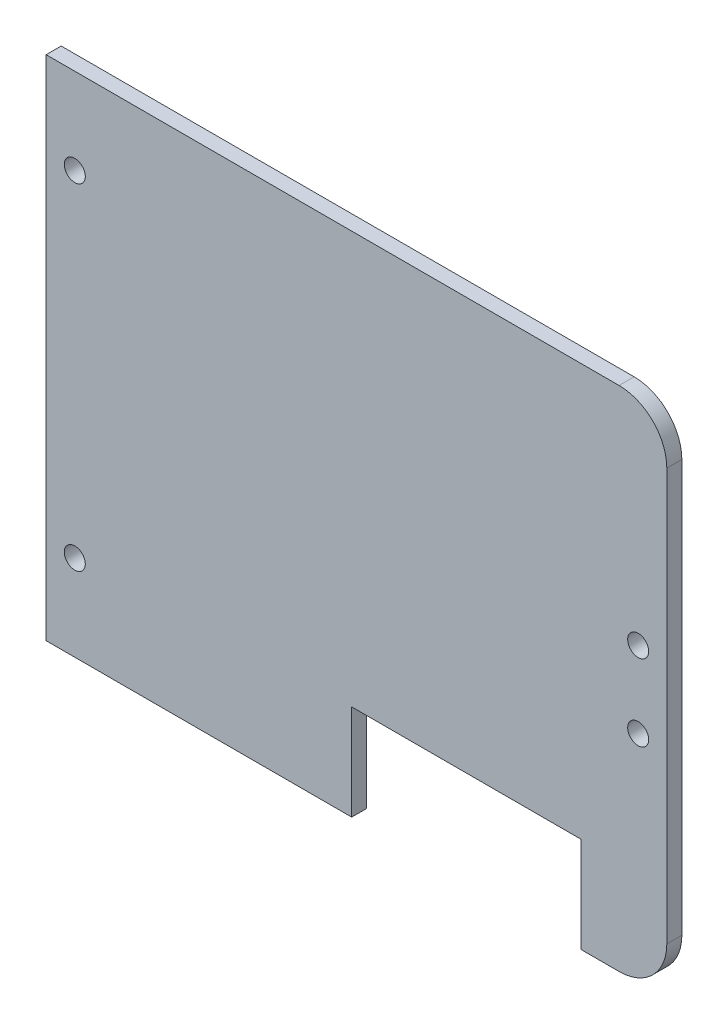
ISO-10303-21;
HEADER;
FILE_DESCRIPTION(('STEP AP214'),'2;1');
FILE_NAME('part.step','',(''),(''),'','','');
FILE_SCHEMA(('AUTOMOTIVE_DESIGN { 1 0 10303 214 1 1 1 1 }'));
ENDSEC;
DATA;
#1=APPLICATION_CONTEXT('core data for automotive mechanical design processes');
#2=APPLICATION_PROTOCOL_DEFINITION('international standard','automotive_design',2000,#1);
#3=PRODUCT_CONTEXT('',#1,'mechanical');
#4=PRODUCT('Part','Part','',(#3));
#5=PRODUCT_RELATED_PRODUCT_CATEGORY('part','',(#4));
#6=PRODUCT_DEFINITION_FORMATION('','',#4);
#7=PRODUCT_DEFINITION_CONTEXT('part definition',#1,'design');
#8=PRODUCT_DEFINITION('design','',#6,#7);
#9=PRODUCT_DEFINITION_SHAPE('','',#8);
#10=(LENGTH_UNIT() NAMED_UNIT(*) SI_UNIT(.MILLI.,.METRE.));
#11=(NAMED_UNIT(*) PLANE_ANGLE_UNIT() SI_UNIT($,.RADIAN.));
#12=(NAMED_UNIT(*) SI_UNIT($,.STERADIAN.) SOLID_ANGLE_UNIT());
#13=UNCERTAINTY_MEASURE_WITH_UNIT(LENGTH_MEASURE(1.E-05),#10,'distance_accuracy_value','');
#14=(GEOMETRIC_REPRESENTATION_CONTEXT(3) GLOBAL_UNCERTAINTY_ASSIGNED_CONTEXT((#13)) GLOBAL_UNIT_ASSIGNED_CONTEXT((#10,
#11,#12)) REPRESENTATION_CONTEXT('',''));
#15=CARTESIAN_POINT('',(0.,0.,0.));
#16=DIRECTION('',(0.,0.,1.));
#17=DIRECTION('',(1.,0.,0.));
#18=AXIS2_PLACEMENT_3D('',#15,#16,#17);
#19=CARTESIAN_POINT('',(59.9999999999886,48.1500000000106,-1.5748));
#20=DIRECTION('',(0.,0.,1.));
#21=DIRECTION('',(1.,0.,0.));
#22=AXIS2_PLACEMENT_3D('',#19,#20,#21);
#23=PLANE('',#22);
#24=CARTESIAN_POINT('',(3.0000000000007,8.99999999999956,-1.5748));
#25=DIRECTION('',(0.,0.,1.));
#26=DIRECTION('',(1.,0.,0.));
#27=AXIS2_PLACEMENT_3D('',#24,#25,#26);
#28=CIRCLE('',#27,1.09999999999992);
#29=CARTESIAN_POINT('',(4.10000000000062,8.99999999999956,-1.5748));
#30=VERTEX_POINT('',#29);
#31=EDGE_CURVE('E128',#30,#30,#28,.T.);
#32=ORIENTED_EDGE('',*,*,#31,.T.);
#33=EDGE_LOOP('',(#32));
#34=FACE_BOUND('',#33,.T.);
#35=CARTESIAN_POINT('',(62.000000000006,22.5750000000011,-1.5748));
#36=DIRECTION('',(0.,0.,1.));
#37=DIRECTION('',(1.,0.,0.));
#38=AXIS2_PLACEMENT_3D('',#35,#36,#37);
#39=CIRCLE('',#38,1.09999999999992);
#40=CARTESIAN_POINT('',(63.1000000000059,22.5750000000011,-1.5748));
#41=VERTEX_POINT('',#40);
#42=EDGE_CURVE('E131',#41,#41,#39,.T.);
#43=ORIENTED_EDGE('',*,*,#42,.T.);
#44=EDGE_LOOP('',(#43));
#45=FACE_BOUND('',#44,.T.);
#46=CARTESIAN_POINT('',(3.0000000000007,44.1500000000012,-1.5748));
#47=DIRECTION('',(0.,0.,1.));
#48=DIRECTION('',(1.,0.,0.));
#49=AXIS2_PLACEMENT_3D('',#46,#47,#48);
#50=CIRCLE('',#49,1.09999999999992);
#51=CARTESIAN_POINT('',(4.10000000000062,44.1500000000012,-1.5748));
#52=VERTEX_POINT('',#51);
#53=EDGE_CURVE('E235',#52,#52,#50,.T.);
#54=ORIENTED_EDGE('',*,*,#53,.T.);
#55=EDGE_LOOP('',(#54));
#56=FACE_BOUND('',#55,.T.);
#57=CARTESIAN_POINT('',(62.000000000006,30.574999999992,-1.5748));
#58=DIRECTION('',(0.,0.,1.));
#59=DIRECTION('',(1.,0.,0.));
#60=AXIS2_PLACEMENT_3D('',#57,#58,#59);
#61=CIRCLE('',#60,1.09999999999992);
#62=CARTESIAN_POINT('',(63.1000000000059,30.574999999992,-1.5748));
#63=VERTEX_POINT('',#62);
#64=EDGE_CURVE('E141',#63,#63,#61,.T.);
#65=ORIENTED_EDGE('',*,*,#64,.T.);
#66=EDGE_LOOP('',(#65));
#67=FACE_BOUND('',#66,.T.);
#68=CARTESIAN_POINT('',(59.9999999999886,5.00000000000032,-1.5748));
#69=DIRECTION('',(0.,0.,1.));
#70=DIRECTION('',(1.,0.,0.));
#71=AXIS2_PLACEMENT_3D('',#68,#69,#70);
#72=CIRCLE('',#71,5.00000000000032);
#73=CARTESIAN_POINT('',(59.9999999999886,0.,-1.5748));
#74=VERTEX_POINT('',#73);
#75=CARTESIAN_POINT('',(64.999999999994,5.00000000000032,-1.5748));
#76=VERTEX_POINT('',#75);
#77=EDGE_CURVE('E22',#74,#76,#72,.T.);
#78=ORIENTED_EDGE('',*,*,#77,.F.);
#79=DIRECTION('',(1.,0.,0.));
#80=VECTOR('',#79,1.);
#81=CARTESIAN_POINT('',(59.9999999999886,0.,-1.5748));
#82=LINE('',#81,#80);
#83=CARTESIAN_POINT('',(56.0000000000046,0.,-1.5748));
#84=VERTEX_POINT('',#83);
#85=EDGE_CURVE('E63',#84,#74,#82,.T.);
#86=ORIENTED_EDGE('',*,*,#85,.F.);
#87=DIRECTION('',(0.,1.,0.));
#88=VECTOR('',#87,1.);
#89=CARTESIAN_POINT('',(56.0000000000046,0.,-1.5748));
#90=LINE('',#89,#88);
#91=CARTESIAN_POINT('',(56.0000000000046,10.0000000000006,-1.5748));
#92=VERTEX_POINT('',#91);
#93=EDGE_CURVE('E73',#92,#84,#90,.F.);
#94=ORIENTED_EDGE('',*,*,#93,.F.);
#95=DIRECTION('',(1.,0.,0.));
#96=VECTOR('',#95,1.);
#97=CARTESIAN_POINT('',(56.0000000000046,10.0000000000006,-1.5748));
#98=LINE('',#97,#96);
#99=CARTESIAN_POINT('',(31.999999999999,10.0000000000006,-1.5748));
#100=VERTEX_POINT('',#99);
#101=EDGE_CURVE('E164',#100,#92,#98,.T.);
#102=ORIENTED_EDGE('',*,*,#101,.F.);
#103=DIRECTION('',(0.,1.,0.));
#104=VECTOR('',#103,1.);
#105=CARTESIAN_POINT('',(31.999999999999,10.0000000000006,-1.5748));
#106=LINE('',#105,#104);
#107=CARTESIAN_POINT('',(31.999999999999,0.,-1.5748));
#108=VERTEX_POINT('',#107);
#109=EDGE_CURVE('E175',#108,#100,#106,.T.);
#110=ORIENTED_EDGE('',*,*,#109,.F.);
#111=DIRECTION('',(1.,0.,0.));
#112=VECTOR('',#111,1.);
#113=CARTESIAN_POINT('',(31.999999999999,0.,-1.5748));
#114=LINE('',#113,#112);
#115=CARTESIAN_POINT('',(0.,0.,-1.5748));
#116=VERTEX_POINT('',#115);
#117=EDGE_CURVE('E185',#116,#108,#114,.T.);
#118=ORIENTED_EDGE('',*,*,#117,.F.);
#119=DIRECTION('',(0.,1.,0.));
#120=VECTOR('',#119,1.);
#121=CARTESIAN_POINT('',(0.,0.,-1.5748));
#122=LINE('',#121,#120);
#123=CARTESIAN_POINT('',(0.,53.1499999999906,-1.5748));
#124=VERTEX_POINT('',#123);
#125=EDGE_CURVE('E112',#124,#116,#122,.F.);
#126=ORIENTED_EDGE('',*,*,#125,.F.);
#127=DIRECTION('',(1.,0.,0.));
#128=VECTOR('',#127,1.);
#129=CARTESIAN_POINT('',(0.,53.1499999999906,-1.5748));
#130=LINE('',#129,#128);
#131=CARTESIAN_POINT('',(59.9999999999886,53.1500000000008,-1.5748));
#132=VERTEX_POINT('',#131);
#133=EDGE_CURVE('E109',#132,#124,#130,.F.);
#134=ORIENTED_EDGE('',*,*,#133,.F.);
#135=CARTESIAN_POINT('',(59.9999999999886,48.1500000000106,-1.5748));
#136=DIRECTION('',(0.,0.,1.));
#137=DIRECTION('',(1.,0.,0.));
#138=AXIS2_PLACEMENT_3D('',#135,#136,#137);
#139=CIRCLE('',#138,5.00000000000032);
#140=CARTESIAN_POINT('',(64.9999999999915,48.1500000000106,-1.5748));
#141=VERTEX_POINT('',#140);
#142=EDGE_CURVE('E142',#141,#132,#139,.T.);
#143=ORIENTED_EDGE('',*,*,#142,.F.);
#144=DIRECTION('',(0.,1.,0.));
#145=VECTOR('',#144,1.);
#146=CARTESIAN_POINT('',(64.999999999994,48.1500000000106,-1.5748));
#147=LINE('',#146,#145);
#148=EDGE_CURVE('E144',#76,#141,#147,.T.);
#149=ORIENTED_EDGE('',*,*,#148,.F.);
#150=EDGE_LOOP('',(#78,#86,#94,#102,#110,#118,#126,#134,#143,#149));
#151=FACE_BOUND('',#150,.T.);
#152=ADVANCED_FACE('F19',(#34,#45,#56,#67,#151),#23,.F.);
#153=CARTESIAN_POINT('',(0.,53.1499999999906,-1.5748));
#154=DIRECTION('',(0.,1.,0.));
#155=DIRECTION('',(0.,0.,1.));
#156=AXIS2_PLACEMENT_3D('',#153,#154,#155);
#157=PLANE('',#156);
#158=DIRECTION('',(0.,0.,1.));
#159=VECTOR('',#158,1.);
#160=CARTESIAN_POINT('',(0.,53.1499999999906,-1.5748));
#161=LINE('',#160,#159);
#162=CARTESIAN_POINT('',(0.,53.1499999999906,0.));
#163=VERTEX_POINT('',#162);
#164=EDGE_CURVE('E102',#163,#124,#161,.F.);
#165=ORIENTED_EDGE('',*,*,#164,.F.);
#166=DIRECTION('',(1.,0.,0.));
#167=VECTOR('',#166,1.);
#168=CARTESIAN_POINT('',(59.9999999999886,53.1499999999906,0.));
#169=LINE('',#168,#167);
#170=CARTESIAN_POINT('',(59.9999999999886,53.1500000000008,0.));
#171=VERTEX_POINT('',#170);
#172=EDGE_CURVE('E107',#171,#163,#169,.F.);
#173=ORIENTED_EDGE('',*,*,#172,.F.);
#174=DIRECTION('',(0.,0.,1.));
#175=VECTOR('',#174,1.);
#176=CARTESIAN_POINT('',(59.9999999999886,53.1500000000109,-1.5748));
#177=LINE('',#176,#175);
#178=EDGE_CURVE('E139',#132,#171,#177,.T.);
#179=ORIENTED_EDGE('',*,*,#178,.F.);
#180=ORIENTED_EDGE('',*,*,#133,.T.);
#181=EDGE_LOOP('',(#165,#173,#179,#180));
#182=FACE_BOUND('',#181,.T.);
#183=ADVANCED_FACE('F104',(#182),#157,.T.);
#184=CARTESIAN_POINT('',(0.,0.,-1.5748));
#185=DIRECTION('',(-1.,0.,0.));
#186=DIRECTION('',(0.,0.,1.));
#187=AXIS2_PLACEMENT_3D('',#184,#185,#186);
#188=PLANE('',#187);
#189=DIRECTION('',(0.,0.,-1.));
#190=VECTOR('',#189,1.);
#191=CARTESIAN_POINT('',(0.,0.,-1.5748));
#192=LINE('',#191,#190);
#193=CARTESIAN_POINT('',(0.,0.,0.));
#194=VERTEX_POINT('',#193);
#195=EDGE_CURVE('E118',#194,#116,#192,.T.);
#196=ORIENTED_EDGE('',*,*,#195,.F.);
#197=DIRECTION('',(0.,1.,0.));
#198=VECTOR('',#197,1.);
#199=CARTESIAN_POINT('',(0.,48.1500000000106,0.));
#200=LINE('',#199,#198);
#201=EDGE_CURVE('E115',#163,#194,#200,.F.);
#202=ORIENTED_EDGE('',*,*,#201,.F.);
#203=ORIENTED_EDGE('',*,*,#164,.T.);
#204=ORIENTED_EDGE('',*,*,#125,.T.);
#205=EDGE_LOOP('',(#196,#202,#203,#204));
#206=FACE_BOUND('',#205,.T.);
#207=ADVANCED_FACE('F116',(#206),#188,.T.);
#208=CARTESIAN_POINT('',(31.999999999999,0.,-1.5748));
#209=DIRECTION('',(0.,-1.,0.));
#210=DIRECTION('',(0.,0.,-1.));
#211=AXIS2_PLACEMENT_3D('',#208,#209,#210);
#212=PLANE('',#211);
#213=DIRECTION('',(0.,0.,-1.));
#214=VECTOR('',#213,1.);
#215=CARTESIAN_POINT('',(31.999999999999,0.,-1.5748));
#216=LINE('',#215,#214);
#217=CARTESIAN_POINT('',(31.999999999999,0.,0.));
#218=VERTEX_POINT('',#217);
#219=EDGE_CURVE('E182',#218,#108,#216,.T.);
#220=ORIENTED_EDGE('',*,*,#219,.F.);
#221=DIRECTION('',(1.,0.,0.));
#222=VECTOR('',#221,1.);
#223=CARTESIAN_POINT('',(59.9999999999886,0.,0.));
#224=LINE('',#223,#222);
#225=EDGE_CURVE('E122',#194,#218,#224,.T.);
#226=ORIENTED_EDGE('',*,*,#225,.F.);
#227=ORIENTED_EDGE('',*,*,#195,.T.);
#228=ORIENTED_EDGE('',*,*,#117,.T.);
#229=EDGE_LOOP('',(#220,#226,#227,#228));
#230=FACE_BOUND('',#229,.T.);
#231=ADVANCED_FACE('F249',(#230),#212,.T.);
#232=CARTESIAN_POINT('',(31.999999999999,10.0000000000006,-1.5748));
#233=DIRECTION('',(1.,0.,0.));
#234=DIRECTION('',(0.,0.,-1.));
#235=AXIS2_PLACEMENT_3D('',#232,#233,#234);
#236=PLANE('',#235);
#237=DIRECTION('',(0.,0.,-1.));
#238=VECTOR('',#237,1.);
#239=CARTESIAN_POINT('',(31.999999999999,10.0000000000006,-1.5748));
#240=LINE('',#239,#238);
#241=CARTESIAN_POINT('',(31.999999999999,10.0000000000006,0.));
#242=VERTEX_POINT('',#241);
#243=EDGE_CURVE('E172',#242,#100,#240,.T.);
#244=ORIENTED_EDGE('',*,*,#243,.F.);
#245=DIRECTION('',(0.,1.,0.));
#246=VECTOR('',#245,1.);
#247=CARTESIAN_POINT('',(31.999999999999,48.1500000000106,0.));
#248=LINE('',#247,#246);
#249=EDGE_CURVE('E169',#218,#242,#248,.T.);
#250=ORIENTED_EDGE('',*,*,#249,.F.);
#251=ORIENTED_EDGE('',*,*,#219,.T.);
#252=ORIENTED_EDGE('',*,*,#109,.T.);
#253=EDGE_LOOP('',(#244,#250,#251,#252));
#254=FACE_BOUND('',#253,.T.);
#255=ADVANCED_FACE('F253',(#254),#236,.T.);
#256=CARTESIAN_POINT('',(56.0000000000046,10.0000000000006,-1.5748));
#257=DIRECTION('',(0.,-1.,0.));
#258=DIRECTION('',(0.,0.,-1.));
#259=AXIS2_PLACEMENT_3D('',#256,#257,#258);
#260=PLANE('',#259);
#261=DIRECTION('',(0.,0.,1.));
#262=VECTOR('',#261,1.);
#263=CARTESIAN_POINT('',(56.0000000000046,10.0000000000006,-1.5748));
#264=LINE('',#263,#262);
#265=CARTESIAN_POINT('',(56.0000000000046,10.0000000000006,0.));
#266=VERTEX_POINT('',#265);
#267=EDGE_CURVE('E162',#266,#92,#264,.F.);
#268=ORIENTED_EDGE('',*,*,#267,.F.);
#269=DIRECTION('',(1.,0.,0.));
#270=VECTOR('',#269,1.);
#271=CARTESIAN_POINT('',(59.9999999999886,10.0000000000006,0.));
#272=LINE('',#271,#270);
#273=EDGE_CURVE('E159',#242,#266,#272,.T.);
#274=ORIENTED_EDGE('',*,*,#273,.F.);
#275=ORIENTED_EDGE('',*,*,#243,.T.);
#276=ORIENTED_EDGE('',*,*,#101,.T.);
#277=EDGE_LOOP('',(#268,#274,#275,#276));
#278=FACE_BOUND('',#277,.T.);
#279=ADVANCED_FACE('F255',(#278),#260,.T.);
#280=CARTESIAN_POINT('',(56.0000000000046,0.,-1.5748));
#281=DIRECTION('',(-1.,0.,0.));
#282=DIRECTION('',(0.,0.,1.));
#283=AXIS2_PLACEMENT_3D('',#280,#281,#282);
#284=PLANE('',#283);
#285=DIRECTION('',(0.,0.,-1.));
#286=VECTOR('',#285,1.);
#287=CARTESIAN_POINT('',(56.0000000000046,0.,-1.5748));
#288=LINE('',#287,#286);
#289=CARTESIAN_POINT('',(56.0000000000046,0.,0.));
#290=VERTEX_POINT('',#289);
#291=EDGE_CURVE('E151',#290,#84,#288,.T.);
#292=ORIENTED_EDGE('',*,*,#291,.F.);
#293=DIRECTION('',(0.,1.,0.));
#294=VECTOR('',#293,1.);
#295=CARTESIAN_POINT('',(56.0000000000046,48.1500000000106,0.));
#296=LINE('',#295,#294);
#297=EDGE_CURVE('E155',#266,#290,#296,.F.);
#298=ORIENTED_EDGE('',*,*,#297,.F.);
#299=ORIENTED_EDGE('',*,*,#267,.T.);
#300=ORIENTED_EDGE('',*,*,#93,.T.);
#301=EDGE_LOOP('',(#292,#298,#299,#300));
#302=FACE_BOUND('',#301,.T.);
#303=ADVANCED_FACE('F257',(#302),#284,.T.);
#304=CARTESIAN_POINT('',(59.9999999999886,0.,-1.5748));
#305=DIRECTION('',(0.,-1.,0.));
#306=DIRECTION('',(0.,0.,-1.));
#307=AXIS2_PLACEMENT_3D('',#304,#305,#306);
#308=PLANE('',#307);
#309=DIRECTION('',(0.,0.,1.));
#310=VECTOR('',#309,1.);
#311=CARTESIAN_POINT('',(59.9999999999886,0.,-1.5748));
#312=LINE('',#311,#310);
#313=CARTESIAN_POINT('',(59.9999999999886,0.,0.));
#314=VERTEX_POINT('',#313);
#315=EDGE_CURVE('E148',#314,#74,#312,.F.);
#316=ORIENTED_EDGE('',*,*,#315,.F.);
#317=DIRECTION('',(1.,0.,0.));
#318=VECTOR('',#317,1.);
#319=CARTESIAN_POINT('',(59.9999999999886,0.,0.));
#320=LINE('',#319,#318);
#321=EDGE_CURVE('E158',#290,#314,#320,.T.);
#322=ORIENTED_EDGE('',*,*,#321,.F.);
#323=ORIENTED_EDGE('',*,*,#291,.T.);
#324=ORIENTED_EDGE('',*,*,#85,.T.);
#325=EDGE_LOOP('',(#316,#322,#323,#324));
#326=FACE_BOUND('',#325,.T.);
#327=ADVANCED_FACE('F265',(#326),#308,.T.);
#328=CARTESIAN_POINT('',(59.9999999999886,5.00000000000032,-1.5748));
#329=DIRECTION('',(0.,0.,1.));
#330=DIRECTION('',(1.,0.,0.));
#331=AXIS2_PLACEMENT_3D('',#328,#329,#330);
#332=CYLINDRICAL_SURFACE('',#331,5.00000000000032);
#333=DIRECTION('',(0.,0.,-1.));
#334=VECTOR('',#333,1.);
#335=CARTESIAN_POINT('',(64.999999999994,5.00000000000032,-1.5748));
#336=LINE('',#335,#334);
#337=CARTESIAN_POINT('',(64.999999999994,5.00000000000032,0.));
#338=VERTEX_POINT('',#337);
#339=EDGE_CURVE('E145',#338,#76,#336,.T.);
#340=ORIENTED_EDGE('',*,*,#339,.F.);
#341=CARTESIAN_POINT('',(59.9999999999886,5.00000000000032,0.));
#342=DIRECTION('',(0.,0.,1.));
#343=DIRECTION('',(1.,0.,0.));
#344=AXIS2_PLACEMENT_3D('',#341,#342,#343);
#345=CIRCLE('',#344,5.00000000000032);
#346=EDGE_CURVE('E230',#314,#338,#345,.T.);
#347=ORIENTED_EDGE('',*,*,#346,.F.);
#348=ORIENTED_EDGE('',*,*,#315,.T.);
#349=ORIENTED_EDGE('',*,*,#77,.T.);
#350=EDGE_LOOP('',(#340,#347,#348,#349));
#351=FACE_BOUND('',#350,.T.);
#352=ADVANCED_FACE('F264',(#351),#332,.T.);
#353=CARTESIAN_POINT('',(64.999999999994,48.1500000000106,-1.5748));
#354=DIRECTION('',(1.,0.,0.));
#355=DIRECTION('',(0.,0.,-1.));
#356=AXIS2_PLACEMENT_3D('',#353,#354,#355);
#357=PLANE('',#356);
#358=DIRECTION('',(0.,0.,1.));
#359=VECTOR('',#358,1.);
#360=CARTESIAN_POINT('',(64.9999999999889,48.1500000000106,-1.5748));
#361=LINE('',#360,#359);
#362=CARTESIAN_POINT('',(64.9999999999915,48.1500000000106,0.));
#363=VERTEX_POINT('',#362);
#364=EDGE_CURVE('E37',#363,#141,#361,.F.);
#365=ORIENTED_EDGE('',*,*,#364,.F.);
#366=DIRECTION('',(0.,1.,0.));
#367=VECTOR('',#366,1.);
#368=CARTESIAN_POINT('',(64.999999999994,48.1500000000106,0.));
#369=LINE('',#368,#367);
#370=EDGE_CURVE('E229',#338,#363,#369,.T.);
#371=ORIENTED_EDGE('',*,*,#370,.F.);
#372=ORIENTED_EDGE('',*,*,#339,.T.);
#373=ORIENTED_EDGE('',*,*,#148,.T.);
#374=EDGE_LOOP('',(#365,#371,#372,#373));
#375=FACE_BOUND('',#374,.T.);
#376=ADVANCED_FACE('F262',(#375),#357,.T.);
#377=CARTESIAN_POINT('',(59.9999999999886,48.1500000000106,-1.5748));
#378=DIRECTION('',(0.,0.,1.));
#379=DIRECTION('',(1.,0.,0.));
#380=AXIS2_PLACEMENT_3D('',#377,#378,#379);
#381=CYLINDRICAL_SURFACE('',#380,5.00000000000032);
#382=ORIENTED_EDGE('',*,*,#178,.T.);
#383=CARTESIAN_POINT('',(59.9999999999886,48.1500000000106,0.));
#384=DIRECTION('',(0.,0.,1.));
#385=DIRECTION('',(1.,0.,0.));
#386=AXIS2_PLACEMENT_3D('',#383,#384,#385);
#387=CIRCLE('',#386,5.00000000000032);
#388=EDGE_CURVE('E127',#363,#171,#387,.T.);
#389=ORIENTED_EDGE('',*,*,#388,.F.);
#390=ORIENTED_EDGE('',*,*,#364,.T.);
#391=ORIENTED_EDGE('',*,*,#142,.T.);
#392=EDGE_LOOP('',(#382,#389,#390,#391));
#393=FACE_BOUND('',#392,.T.);
#394=ADVANCED_FACE('F242',(#393),#381,.T.);
#395=CARTESIAN_POINT('',(62.000000000006,30.574999999992,-1.5748));
#396=DIRECTION('',(0.,0.,1.));
#397=DIRECTION('',(1.,0.,0.));
#398=AXIS2_PLACEMENT_3D('',#395,#396,#397);
#399=CYLINDRICAL_SURFACE('',#398,1.09999999999992);
#400=CARTESIAN_POINT('',(62.000000000006,30.574999999992,0.));
#401=DIRECTION('',(0.,0.,1.));
#402=DIRECTION('',(1.,0.,0.));
#403=AXIS2_PLACEMENT_3D('',#400,#401,#402);
#404=CIRCLE('',#403,1.09999999999992);
#405=CARTESIAN_POINT('',(63.1000000000059,30.574999999992,0.));
#406=VERTEX_POINT('',#405);
#407=EDGE_CURVE('E225',#406,#406,#404,.F.);
#408=ORIENTED_EDGE('',*,*,#407,.F.);
#409=EDGE_LOOP('',(#408));
#410=FACE_BOUND('',#409,.T.);
#411=ORIENTED_EDGE('',*,*,#64,.F.);
#412=EDGE_LOOP('',(#411));
#413=FACE_BOUND('',#412,.T.);
#414=ADVANCED_FACE('F293',(#410,#413),#399,.F.);
#415=CARTESIAN_POINT('',(3.0000000000007,44.1500000000012,-1.5748));
#416=DIRECTION('',(0.,0.,1.));
#417=DIRECTION('',(1.,0.,0.));
#418=AXIS2_PLACEMENT_3D('',#415,#416,#417);
#419=CYLINDRICAL_SURFACE('',#418,1.09999999999992);
#420=CARTESIAN_POINT('',(3.0000000000007,44.1500000000012,0.));
#421=DIRECTION('',(0.,0.,1.));
#422=DIRECTION('',(1.,0.,0.));
#423=AXIS2_PLACEMENT_3D('',#420,#421,#422);
#424=CIRCLE('',#423,1.09999999999992);
#425=CARTESIAN_POINT('',(4.10000000000062,44.1500000000012,0.));
#426=VERTEX_POINT('',#425);
#427=EDGE_CURVE('E222',#426,#426,#424,.F.);
#428=ORIENTED_EDGE('',*,*,#427,.F.);
#429=EDGE_LOOP('',(#428));
#430=FACE_BOUND('',#429,.T.);
#431=ORIENTED_EDGE('',*,*,#53,.F.);
#432=EDGE_LOOP('',(#431));
#433=FACE_BOUND('',#432,.T.);
#434=ADVANCED_FACE('F289',(#430,#433),#419,.F.);
#435=CARTESIAN_POINT('',(62.000000000006,22.5750000000011,-1.5748));
#436=DIRECTION('',(0.,0.,1.));
#437=DIRECTION('',(1.,0.,0.));
#438=AXIS2_PLACEMENT_3D('',#435,#436,#437);
#439=CYLINDRICAL_SURFACE('',#438,1.09999999999992);
#440=CARTESIAN_POINT('',(62.000000000006,22.5750000000011,0.));
#441=DIRECTION('',(0.,0.,1.));
#442=DIRECTION('',(1.,0.,0.));
#443=AXIS2_PLACEMENT_3D('',#440,#441,#442);
#444=CIRCLE('',#443,1.09999999999992);
#445=CARTESIAN_POINT('',(63.1000000000059,22.5750000000011,0.));
#446=VERTEX_POINT('',#445);
#447=EDGE_CURVE('E28',#446,#446,#444,.F.);
#448=ORIENTED_EDGE('',*,*,#447,.F.);
#449=EDGE_LOOP('',(#448));
#450=FACE_BOUND('',#449,.T.);
#451=ORIENTED_EDGE('',*,*,#42,.F.);
#452=EDGE_LOOP('',(#451));
#453=FACE_BOUND('',#452,.T.);
#454=ADVANCED_FACE('F282',(#450,#453),#439,.F.);
#455=CARTESIAN_POINT('',(3.0000000000007,8.99999999999956,-1.5748));
#456=DIRECTION('',(0.,0.,1.));
#457=DIRECTION('',(1.,0.,0.));
#458=AXIS2_PLACEMENT_3D('',#455,#456,#457);
#459=CYLINDRICAL_SURFACE('',#458,1.09999999999992);
#460=CARTESIAN_POINT('',(3.0000000000007,8.99999999999956,0.));
#461=DIRECTION('',(0.,0.,1.));
#462=DIRECTION('',(1.,0.,0.));
#463=AXIS2_PLACEMENT_3D('',#460,#461,#462);
#464=CIRCLE('',#463,1.09999999999992);
#465=CARTESIAN_POINT('',(4.10000000000062,8.99999999999956,0.));
#466=VERTEX_POINT('',#465);
#467=EDGE_CURVE('E11',#466,#466,#464,.F.);
#468=ORIENTED_EDGE('',*,*,#467,.F.);
#469=EDGE_LOOP('',(#468));
#470=FACE_BOUND('',#469,.T.);
#471=ORIENTED_EDGE('',*,*,#31,.F.);
#472=EDGE_LOOP('',(#471));
#473=FACE_BOUND('',#472,.T.);
#474=ADVANCED_FACE('F276',(#470,#473),#459,.F.);
#475=CARTESIAN_POINT('',(59.9999999999886,48.1500000000106,0.));
#476=DIRECTION('',(0.,0.,1.));
#477=DIRECTION('',(1.,0.,0.));
#478=AXIS2_PLACEMENT_3D('',#475,#476,#477);
#479=PLANE('',#478);
#480=ORIENTED_EDGE('',*,*,#467,.T.);
#481=EDGE_LOOP('',(#480));
#482=FACE_BOUND('',#481,.T.);
#483=ORIENTED_EDGE('',*,*,#447,.T.);
#484=EDGE_LOOP('',(#483));
#485=FACE_BOUND('',#484,.T.);
#486=ORIENTED_EDGE('',*,*,#427,.T.);
#487=EDGE_LOOP('',(#486));
#488=FACE_BOUND('',#487,.T.);
#489=ORIENTED_EDGE('',*,*,#407,.T.);
#490=EDGE_LOOP('',(#489));
#491=FACE_BOUND('',#490,.T.);
#492=ORIENTED_EDGE('',*,*,#370,.T.);
#493=ORIENTED_EDGE('',*,*,#388,.T.);
#494=ORIENTED_EDGE('',*,*,#172,.T.);
#495=ORIENTED_EDGE('',*,*,#201,.T.);
#496=ORIENTED_EDGE('',*,*,#225,.T.);
#497=ORIENTED_EDGE('',*,*,#249,.T.);
#498=ORIENTED_EDGE('',*,*,#273,.T.);
#499=ORIENTED_EDGE('',*,*,#297,.T.);
#500=ORIENTED_EDGE('',*,*,#321,.T.);
#501=ORIENTED_EDGE('',*,*,#346,.T.);
#502=EDGE_LOOP('',(#492,#493,#494,#495,#496,#497,#498,#499,#500,#501));
#503=FACE_BOUND('',#502,.T.);
#504=ADVANCED_FACE('F126',(#482,#485,#488,#491,#503),#479,.T.);
#505=CLOSED_SHELL('',(#152,#183,#207,#231,#255,#279,#303,#327,#352,#376,#394,#414,#434,#454,
#474,#504));
#506=MANIFOLD_SOLID_BREP('B1',#505);
#507=ADVANCED_BREP_SHAPE_REPRESENTATION('',(#18,#506),#14);
#508=SHAPE_DEFINITION_REPRESENTATION(#9,#507);
ENDSEC;
END-ISO-10303-21;
